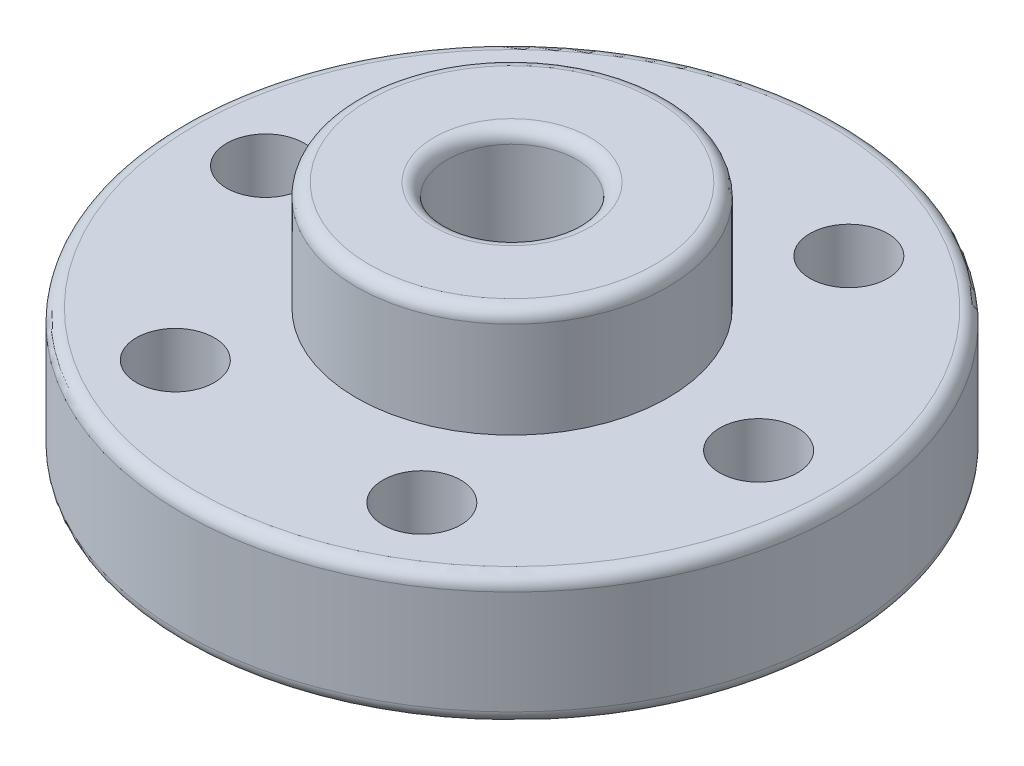
ISO-10303-21;
HEADER;
FILE_DESCRIPTION(('STEP AP214'),'2;1');
FILE_NAME('part.step','',(''),(''),'','','');
FILE_SCHEMA(('AUTOMOTIVE_DESIGN { 1 0 10303 214 1 1 1 1 }'));
ENDSEC;
DATA;
#1=APPLICATION_CONTEXT('core data for automotive mechanical design processes');
#2=APPLICATION_PROTOCOL_DEFINITION('international standard','automotive_design',2000,#1);
#3=PRODUCT_CONTEXT('',#1,'mechanical');
#4=PRODUCT('Part','Part','',(#3));
#5=PRODUCT_RELATED_PRODUCT_CATEGORY('part','',(#4));
#6=PRODUCT_DEFINITION_FORMATION('','',#4);
#7=PRODUCT_DEFINITION_CONTEXT('part definition',#1,'design');
#8=PRODUCT_DEFINITION('design','',#6,#7);
#9=PRODUCT_DEFINITION_SHAPE('','',#8);
#10=(LENGTH_UNIT() NAMED_UNIT(*) SI_UNIT(.MILLI.,.METRE.));
#11=(NAMED_UNIT(*) PLANE_ANGLE_UNIT() SI_UNIT($,.RADIAN.));
#12=(NAMED_UNIT(*) SI_UNIT($,.STERADIAN.) SOLID_ANGLE_UNIT());
#13=UNCERTAINTY_MEASURE_WITH_UNIT(LENGTH_MEASURE(1.E-05),#10,'distance_accuracy_value','');
#14=(GEOMETRIC_REPRESENTATION_CONTEXT(3) GLOBAL_UNCERTAINTY_ASSIGNED_CONTEXT((#13)) GLOBAL_UNIT_ASSIGNED_CONTEXT((#10,
#11,#12)) REPRESENTATION_CONTEXT('',''));
#15=CARTESIAN_POINT('',(0.,0.,0.));
#16=DIRECTION('',(0.,0.,1.));
#17=DIRECTION('',(1.,0.,0.));
#18=AXIS2_PLACEMENT_3D('',#15,#16,#17);
#19=CARTESIAN_POINT('',(-4.74999999999999,5.,-8.22724133595217));
#20=DIRECTION('',(0.,-1.,0.));
#21=DIRECTION('',(0.,0.,-1.));
#22=AXIS2_PLACEMENT_3D('',#19,#20,#21);
#23=CYLINDRICAL_SURFACE('',#22,1.5);
#24=CARTESIAN_POINT('',(-4.74999999999999,5.,-8.22724133595217));
#25=DIRECTION('',(0.,1.,0.));
#26=DIRECTION('',(0.,0.,1.));
#27=AXIS2_PLACEMENT_3D('',#24,#25,#26);
#28=CIRCLE('',#27,1.5);
#29=CARTESIAN_POINT('',(-4.74999999999999,5.,-6.72724133595217));
#30=VERTEX_POINT('',#29);
#31=EDGE_CURVE('E70',#30,#30,#28,.T.);
#32=ORIENTED_EDGE('',*,*,#31,.T.);
#33=EDGE_LOOP('',(#32));
#34=FACE_BOUND('',#33,.T.);
#35=CARTESIAN_POINT('',(-4.74999999999999,0.,-8.22724133595217));
#36=DIRECTION('',(0.,1.,0.));
#37=DIRECTION('',(0.,0.,1.));
#38=AXIS2_PLACEMENT_3D('',#35,#36,#37);
#39=CIRCLE('',#38,1.5);
#40=CARTESIAN_POINT('',(-4.74999999999999,0.,-6.72724133595217));
#41=VERTEX_POINT('',#40);
#42=EDGE_CURVE('E71',#41,#41,#39,.T.);
#43=ORIENTED_EDGE('',*,*,#42,.F.);
#44=EDGE_LOOP('',(#43));
#45=FACE_BOUND('',#44,.T.);
#46=ADVANCED_FACE('F32',(#34,#45),#23,.F.);
#47=CARTESIAN_POINT('',(-9.5,5.,0.));
#48=DIRECTION('',(0.,-1.,0.));
#49=DIRECTION('',(0.,0.,-1.));
#50=AXIS2_PLACEMENT_3D('',#47,#48,#49);
#51=CYLINDRICAL_SURFACE('',#50,1.5);
#52=CARTESIAN_POINT('',(-9.5,5.,0.));
#53=DIRECTION('',(0.,1.,0.));
#54=DIRECTION('',(0.,0.,1.));
#55=AXIS2_PLACEMENT_3D('',#52,#53,#54);
#56=CIRCLE('',#55,1.5);
#57=CARTESIAN_POINT('',(-9.5,5.,1.5));
#58=VERTEX_POINT('',#57);
#59=EDGE_CURVE('E93',#58,#58,#56,.T.);
#60=ORIENTED_EDGE('',*,*,#59,.T.);
#61=EDGE_LOOP('',(#60));
#62=FACE_BOUND('',#61,.T.);
#63=CARTESIAN_POINT('',(-9.5,0.,0.));
#64=DIRECTION('',(0.,1.,0.));
#65=DIRECTION('',(0.,0.,1.));
#66=AXIS2_PLACEMENT_3D('',#63,#64,#65);
#67=CIRCLE('',#66,1.5);
#68=CARTESIAN_POINT('',(-9.5,0.,1.5));
#69=VERTEX_POINT('',#68);
#70=EDGE_CURVE('E75',#69,#69,#67,.T.);
#71=ORIENTED_EDGE('',*,*,#70,.F.);
#72=EDGE_LOOP('',(#71));
#73=FACE_BOUND('',#72,.T.);
#74=ADVANCED_FACE('F132',(#62,#73),#51,.F.);
#75=CARTESIAN_POINT('',(-4.75,5.,8.22724133595217));
#76=DIRECTION('',(0.,-1.,0.));
#77=DIRECTION('',(0.,0.,-1.));
#78=AXIS2_PLACEMENT_3D('',#75,#76,#77);
#79=CYLINDRICAL_SURFACE('',#78,1.5);
#80=CARTESIAN_POINT('',(-4.75,5.,8.22724133595217));
#81=DIRECTION('',(0.,1.,0.));
#82=DIRECTION('',(0.,0.,1.));
#83=AXIS2_PLACEMENT_3D('',#80,#81,#82);
#84=CIRCLE('',#83,1.5);
#85=CARTESIAN_POINT('',(-4.75,5.,9.72724133595217));
#86=VERTEX_POINT('',#85);
#87=EDGE_CURVE('E96',#86,#86,#84,.T.);
#88=ORIENTED_EDGE('',*,*,#87,.T.);
#89=EDGE_LOOP('',(#88));
#90=FACE_BOUND('',#89,.T.);
#91=CARTESIAN_POINT('',(-4.75,0.,8.22724133595217));
#92=DIRECTION('',(0.,1.,0.));
#93=DIRECTION('',(0.,0.,1.));
#94=AXIS2_PLACEMENT_3D('',#91,#92,#93);
#95=CIRCLE('',#94,1.5);
#96=CARTESIAN_POINT('',(-4.75,0.,9.72724133595217));
#97=VERTEX_POINT('',#96);
#98=EDGE_CURVE('E78',#97,#97,#95,.T.);
#99=ORIENTED_EDGE('',*,*,#98,.F.);
#100=EDGE_LOOP('',(#99));
#101=FACE_BOUND('',#100,.T.);
#102=ADVANCED_FACE('F152',(#90,#101),#79,.F.);
#103=CARTESIAN_POINT('',(4.75,5.,8.22724133595217));
#104=DIRECTION('',(0.,-1.,0.));
#105=DIRECTION('',(0.,0.,-1.));
#106=AXIS2_PLACEMENT_3D('',#103,#104,#105);
#107=CYLINDRICAL_SURFACE('',#106,1.5);
#108=CARTESIAN_POINT('',(4.75,5.,8.22724133595217));
#109=DIRECTION('',(0.,1.,0.));
#110=DIRECTION('',(0.,0.,1.));
#111=AXIS2_PLACEMENT_3D('',#108,#109,#110);
#112=CIRCLE('',#111,1.5);
#113=CARTESIAN_POINT('',(4.75,5.,9.72724133595217));
#114=VERTEX_POINT('',#113);
#115=EDGE_CURVE('E99',#114,#114,#112,.T.);
#116=ORIENTED_EDGE('',*,*,#115,.T.);
#117=EDGE_LOOP('',(#116));
#118=FACE_BOUND('',#117,.T.);
#119=CARTESIAN_POINT('',(4.75,0.,8.22724133595217));
#120=DIRECTION('',(0.,1.,0.));
#121=DIRECTION('',(0.,0.,1.));
#122=AXIS2_PLACEMENT_3D('',#119,#120,#121);
#123=CIRCLE('',#122,1.5);
#124=CARTESIAN_POINT('',(4.75,0.,9.72724133595217));
#125=VERTEX_POINT('',#124);
#126=EDGE_CURVE('E81',#125,#125,#123,.T.);
#127=ORIENTED_EDGE('',*,*,#126,.F.);
#128=EDGE_LOOP('',(#127));
#129=FACE_BOUND('',#128,.T.);
#130=ADVANCED_FACE('F156',(#118,#129),#107,.F.);
#131=CARTESIAN_POINT('',(9.5,5.,0.));
#132=DIRECTION('',(0.,-1.,0.));
#133=DIRECTION('',(0.,0.,-1.));
#134=AXIS2_PLACEMENT_3D('',#131,#132,#133);
#135=CYLINDRICAL_SURFACE('',#134,1.5);
#136=CARTESIAN_POINT('',(9.5,5.,0.));
#137=DIRECTION('',(0.,1.,0.));
#138=DIRECTION('',(0.,0.,1.));
#139=AXIS2_PLACEMENT_3D('',#136,#137,#138);
#140=CIRCLE('',#139,1.5);
#141=CARTESIAN_POINT('',(9.5,5.,1.5));
#142=VERTEX_POINT('',#141);
#143=EDGE_CURVE('E102',#142,#142,#140,.T.);
#144=ORIENTED_EDGE('',*,*,#143,.T.);
#145=EDGE_LOOP('',(#144));
#146=FACE_BOUND('',#145,.T.);
#147=CARTESIAN_POINT('',(9.5,0.,0.));
#148=DIRECTION('',(0.,1.,0.));
#149=DIRECTION('',(0.,0.,1.));
#150=AXIS2_PLACEMENT_3D('',#147,#148,#149);
#151=CIRCLE('',#150,1.5);
#152=CARTESIAN_POINT('',(9.5,0.,1.5));
#153=VERTEX_POINT('',#152);
#154=EDGE_CURVE('E84',#153,#153,#151,.T.);
#155=ORIENTED_EDGE('',*,*,#154,.F.);
#156=EDGE_LOOP('',(#155));
#157=FACE_BOUND('',#156,.T.);
#158=ADVANCED_FACE('F160',(#146,#157),#135,.F.);
#159=CARTESIAN_POINT('',(0.,5.,0.));
#160=DIRECTION('',(0.,-1.,0.));
#161=DIRECTION('',(0.,0.,-1.));
#162=AXIS2_PLACEMENT_3D('',#159,#160,#161);
#163=CYLINDRICAL_SURFACE('',#162,2.5);
#164=CARTESIAN_POINT('',(0.,0.5,0.));
#165=DIRECTION('',(0.,1.,0.));
#166=DIRECTION('',(0.,0.,1.));
#167=AXIS2_PLACEMENT_3D('',#164,#165,#166);
#168=CIRCLE('',#167,2.5);
#169=CARTESIAN_POINT('',(0.,0.5,2.5));
#170=VERTEX_POINT('',#169);
#171=EDGE_CURVE('E58',#170,#170,#168,.F.);
#172=ORIENTED_EDGE('',*,*,#171,.T.);
#173=EDGE_LOOP('',(#172));
#174=FACE_BOUND('',#173,.T.);
#175=CARTESIAN_POINT('',(0.,8.7,0.));
#176=DIRECTION('',(0.,1.,0.));
#177=DIRECTION('',(0.,0.,1.));
#178=AXIS2_PLACEMENT_3D('',#175,#176,#177);
#179=CIRCLE('',#178,2.5);
#180=CARTESIAN_POINT('',(0.,8.7,2.5));
#181=VERTEX_POINT('',#180);
#182=EDGE_CURVE('E61',#181,#181,#179,.T.);
#183=ORIENTED_EDGE('',*,*,#182,.T.);
#184=EDGE_LOOP('',(#183));
#185=FACE_BOUND('',#184,.T.);
#186=ADVANCED_FACE('F164',(#174,#185),#163,.F.);
#187=CARTESIAN_POINT('',(4.75000000000001,5.,-8.22724133595217));
#188=DIRECTION('',(0.,-1.,0.));
#189=DIRECTION('',(0.,0.,-1.));
#190=AXIS2_PLACEMENT_3D('',#187,#188,#189);
#191=CYLINDRICAL_SURFACE('',#190,1.5);
#192=CARTESIAN_POINT('',(4.75000000000001,5.,-8.22724133595217));
#193=DIRECTION('',(0.,1.,0.));
#194=DIRECTION('',(0.,0.,1.));
#195=AXIS2_PLACEMENT_3D('',#192,#193,#194);
#196=CIRCLE('',#195,1.5);
#197=CARTESIAN_POINT('',(4.75000000000001,5.,-6.72724133595217));
#198=VERTEX_POINT('',#197);
#199=EDGE_CURVE('E74',#198,#198,#196,.T.);
#200=ORIENTED_EDGE('',*,*,#199,.T.);
#201=EDGE_LOOP('',(#200));
#202=FACE_BOUND('',#201,.T.);
#203=CARTESIAN_POINT('',(4.75000000000001,0.,-8.22724133595217));
#204=DIRECTION('',(0.,1.,0.));
#205=DIRECTION('',(0.,0.,1.));
#206=AXIS2_PLACEMENT_3D('',#203,#204,#205);
#207=CIRCLE('',#206,1.5);
#208=CARTESIAN_POINT('',(4.75000000000001,0.,-6.72724133595217));
#209=VERTEX_POINT('',#208);
#210=EDGE_CURVE('E87',#209,#209,#207,.T.);
#211=ORIENTED_EDGE('',*,*,#210,.F.);
#212=EDGE_LOOP('',(#211));
#213=FACE_BOUND('',#212,.T.);
#214=ADVANCED_FACE('F147',(#202,#213),#191,.F.);
#215=CARTESIAN_POINT('',(0.,5.,0.));
#216=DIRECTION('',(0.,-1.,0.));
#217=DIRECTION('',(0.,0.,-1.));
#218=AXIS2_PLACEMENT_3D('',#215,#216,#217);
#219=CYLINDRICAL_SURFACE('',#218,12.7);
#220=CARTESIAN_POINT('',(0.,0.5,0.));
#221=DIRECTION('',(0.,1.,0.));
#222=DIRECTION('',(0.,0.,1.));
#223=AXIS2_PLACEMENT_3D('',#220,#221,#222);
#224=CIRCLE('',#223,12.7);
#225=CARTESIAN_POINT('',(0.,0.5,12.7));
#226=VERTEX_POINT('',#225);
#227=EDGE_CURVE('E52',#226,#226,#224,.T.);
#228=ORIENTED_EDGE('',*,*,#227,.T.);
#229=EDGE_LOOP('',(#228));
#230=FACE_BOUND('',#229,.T.);
#231=CARTESIAN_POINT('',(0.,4.5,0.));
#232=DIRECTION('',(0.,1.,0.));
#233=DIRECTION('',(0.,0.,1.));
#234=AXIS2_PLACEMENT_3D('',#231,#232,#233);
#235=CIRCLE('',#234,12.7);
#236=CARTESIAN_POINT('',(0.,4.5,12.7));
#237=VERTEX_POINT('',#236);
#238=EDGE_CURVE('E55',#237,#237,#235,.F.);
#239=ORIENTED_EDGE('',*,*,#238,.T.);
#240=EDGE_LOOP('',(#239));
#241=FACE_BOUND('',#240,.T.);
#242=ADVANCED_FACE('F116',(#230,#241),#219,.T.);
#243=CARTESIAN_POINT('',(0.,5.,0.));
#244=DIRECTION('',(0.,1.,0.));
#245=DIRECTION('',(0.,0.,1.));
#246=AXIS2_PLACEMENT_3D('',#243,#244,#245);
#247=PLANE('',#246);
#248=CARTESIAN_POINT('',(0.,5.,0.));
#249=DIRECTION('',(0.,1.,0.));
#250=DIRECTION('',(0.,0.,1.));
#251=AXIS2_PLACEMENT_3D('',#248,#249,#250);
#252=CIRCLE('',#251,12.2);
#253=CARTESIAN_POINT('',(0.,5.,12.2));
#254=VERTEX_POINT('',#253);
#255=EDGE_CURVE('E39',#254,#254,#252,.T.);
#256=ORIENTED_EDGE('',*,*,#255,.T.);
#257=EDGE_LOOP('',(#256));
#258=FACE_BOUND('',#257,.T.);
#259=CARTESIAN_POINT('',(0.,5.,0.));
#260=DIRECTION('',(0.,1.,0.));
#261=DIRECTION('',(0.,0.,1.));
#262=AXIS2_PLACEMENT_3D('',#259,#260,#261);
#263=CIRCLE('',#262,6.);
#264=CARTESIAN_POINT('',(0.,5.,6.));
#265=VERTEX_POINT('',#264);
#266=EDGE_CURVE('E90',#265,#265,#263,.T.);
#267=ORIENTED_EDGE('',*,*,#266,.F.);
#268=EDGE_LOOP('',(#267));
#269=FACE_BOUND('',#268,.T.);
#270=ORIENTED_EDGE('',*,*,#199,.F.);
#271=EDGE_LOOP('',(#270));
#272=FACE_BOUND('',#271,.T.);
#273=ORIENTED_EDGE('',*,*,#143,.F.);
#274=EDGE_LOOP('',(#273));
#275=FACE_BOUND('',#274,.T.);
#276=ORIENTED_EDGE('',*,*,#115,.F.);
#277=EDGE_LOOP('',(#276));
#278=FACE_BOUND('',#277,.T.);
#279=ORIENTED_EDGE('',*,*,#87,.F.);
#280=EDGE_LOOP('',(#279));
#281=FACE_BOUND('',#280,.T.);
#282=ORIENTED_EDGE('',*,*,#59,.F.);
#283=EDGE_LOOP('',(#282));
#284=FACE_BOUND('',#283,.T.);
#285=ORIENTED_EDGE('',*,*,#31,.F.);
#286=EDGE_LOOP('',(#285));
#287=FACE_BOUND('',#286,.T.);
#288=ADVANCED_FACE('F112',(#258,#269,#272,#275,#278,#281,#284,#287),#247,.T.);
#289=CARTESIAN_POINT('',(0.,0.,0.));
#290=DIRECTION('',(0.,1.,0.));
#291=DIRECTION('',(0.,0.,1.));
#292=AXIS2_PLACEMENT_3D('',#289,#290,#291);
#293=PLANE('',#292);
#294=CARTESIAN_POINT('',(0.,0.,0.));
#295=DIRECTION('',(0.,1.,0.));
#296=DIRECTION('',(0.,0.,1.));
#297=AXIS2_PLACEMENT_3D('',#294,#295,#296);
#298=CIRCLE('',#297,3.);
#299=CARTESIAN_POINT('',(0.,0.,3.));
#300=VERTEX_POINT('',#299);
#301=EDGE_CURVE('E64',#300,#300,#298,.T.);
#302=ORIENTED_EDGE('',*,*,#301,.T.);
#303=EDGE_LOOP('',(#302));
#304=FACE_BOUND('',#303,.T.);
#305=CARTESIAN_POINT('',(0.,0.,0.));
#306=DIRECTION('',(0.,1.,0.));
#307=DIRECTION('',(0.,0.,1.));
#308=AXIS2_PLACEMENT_3D('',#305,#306,#307);
#309=CIRCLE('',#308,12.2);
#310=CARTESIAN_POINT('',(0.,0.,12.2));
#311=VERTEX_POINT('',#310);
#312=EDGE_CURVE('E67',#311,#311,#309,.F.);
#313=ORIENTED_EDGE('',*,*,#312,.T.);
#314=EDGE_LOOP('',(#313));
#315=FACE_BOUND('',#314,.T.);
#316=ORIENTED_EDGE('',*,*,#210,.T.);
#317=EDGE_LOOP('',(#316));
#318=FACE_BOUND('',#317,.T.);
#319=ORIENTED_EDGE('',*,*,#154,.T.);
#320=EDGE_LOOP('',(#319));
#321=FACE_BOUND('',#320,.T.);
#322=ORIENTED_EDGE('',*,*,#126,.T.);
#323=EDGE_LOOP('',(#322));
#324=FACE_BOUND('',#323,.T.);
#325=ORIENTED_EDGE('',*,*,#98,.T.);
#326=EDGE_LOOP('',(#325));
#327=FACE_BOUND('',#326,.T.);
#328=ORIENTED_EDGE('',*,*,#70,.T.);
#329=EDGE_LOOP('',(#328));
#330=FACE_BOUND('',#329,.T.);
#331=ORIENTED_EDGE('',*,*,#42,.T.);
#332=EDGE_LOOP('',(#331));
#333=FACE_BOUND('',#332,.T.);
#334=ADVANCED_FACE('F115',(#304,#315,#318,#321,#324,#327,#330,#333),#293,.F.);
#335=CARTESIAN_POINT('',(0.,9.2,0.));
#336=DIRECTION('',(0.,-1.,0.));
#337=DIRECTION('',(0.,0.,-1.));
#338=AXIS2_PLACEMENT_3D('',#335,#336,#337);
#339=CYLINDRICAL_SURFACE('',#338,6.);
#340=CARTESIAN_POINT('',(0.,8.7,0.));
#341=DIRECTION('',(0.,1.,0.));
#342=DIRECTION('',(0.,0.,1.));
#343=AXIS2_PLACEMENT_3D('',#340,#341,#342);
#344=CIRCLE('',#343,6.);
#345=CARTESIAN_POINT('',(0.,8.7,6.));
#346=VERTEX_POINT('',#345);
#347=EDGE_CURVE('E10',#346,#346,#344,.F.);
#348=ORIENTED_EDGE('',*,*,#347,.T.);
#349=EDGE_LOOP('',(#348));
#350=FACE_BOUND('',#349,.T.);
#351=ORIENTED_EDGE('',*,*,#266,.T.);
#352=EDGE_LOOP('',(#351));
#353=FACE_BOUND('',#352,.T.);
#354=ADVANCED_FACE('F110',(#350,#353),#339,.T.);
#355=CARTESIAN_POINT('',(0.,9.2,0.));
#356=DIRECTION('',(0.,1.,0.));
#357=DIRECTION('',(0.,0.,1.));
#358=AXIS2_PLACEMENT_3D('',#355,#356,#357);
#359=PLANE('',#358);
#360=CARTESIAN_POINT('',(0.,9.2,0.));
#361=DIRECTION('',(0.,1.,0.));
#362=DIRECTION('',(0.,0.,1.));
#363=AXIS2_PLACEMENT_3D('',#360,#361,#362);
#364=CIRCLE('',#363,3.);
#365=CARTESIAN_POINT('',(0.,9.2,3.));
#366=VERTEX_POINT('',#365);
#367=EDGE_CURVE('E43',#366,#366,#364,.F.);
#368=ORIENTED_EDGE('',*,*,#367,.T.);
#369=EDGE_LOOP('',(#368));
#370=FACE_BOUND('',#369,.T.);
#371=CARTESIAN_POINT('',(0.,9.2,0.));
#372=DIRECTION('',(0.,1.,0.));
#373=DIRECTION('',(0.,0.,1.));
#374=AXIS2_PLACEMENT_3D('',#371,#372,#373);
#375=CIRCLE('',#374,5.5);
#376=CARTESIAN_POINT('',(0.,9.2,5.5));
#377=VERTEX_POINT('',#376);
#378=EDGE_CURVE('E47',#377,#377,#375,.T.);
#379=ORIENTED_EDGE('',*,*,#378,.T.);
#380=EDGE_LOOP('',(#379));
#381=FACE_BOUND('',#380,.T.);
#382=ADVANCED_FACE('F142',(#370,#381),#359,.T.);
#383=CARTESIAN_POINT('',(0.,0.5,0.));
#384=DIRECTION('',(0.,1.,0.));
#385=DIRECTION('',(0.,0.,1.));
#386=AXIS2_PLACEMENT_3D('',#383,#384,#385);
#387=TOROIDAL_SURFACE('',#386,3.,0.5);
#388=ORIENTED_EDGE('',*,*,#171,.F.);
#389=EDGE_LOOP('',(#388));
#390=FACE_BOUND('',#389,.T.);
#391=ORIENTED_EDGE('',*,*,#301,.F.);
#392=EDGE_LOOP('',(#391));
#393=FACE_BOUND('',#392,.T.);
#394=ADVANCED_FACE('F172',(#390,#393),#387,.T.);
#395=CARTESIAN_POINT('',(0.,0.5,0.));
#396=DIRECTION('',(0.,1.,0.));
#397=DIRECTION('',(0.,0.,1.));
#398=AXIS2_PLACEMENT_3D('',#395,#396,#397);
#399=TOROIDAL_SURFACE('',#398,12.2,0.5);
#400=ORIENTED_EDGE('',*,*,#312,.F.);
#401=EDGE_LOOP('',(#400));
#402=FACE_BOUND('',#401,.T.);
#403=ORIENTED_EDGE('',*,*,#227,.F.);
#404=EDGE_LOOP('',(#403));
#405=FACE_BOUND('',#404,.T.);
#406=ADVANCED_FACE('F175',(#402,#405),#399,.T.);
#407=CARTESIAN_POINT('',(0.,8.7,0.));
#408=DIRECTION('',(0.,1.,0.));
#409=DIRECTION('',(0.,0.,1.));
#410=AXIS2_PLACEMENT_3D('',#407,#408,#409);
#411=TOROIDAL_SURFACE('',#410,3.,0.5);
#412=ORIENTED_EDGE('',*,*,#367,.F.);
#413=EDGE_LOOP('',(#412));
#414=FACE_BOUND('',#413,.T.);
#415=ORIENTED_EDGE('',*,*,#182,.F.);
#416=EDGE_LOOP('',(#415));
#417=FACE_BOUND('',#416,.T.);
#418=ADVANCED_FACE('F179',(#414,#417),#411,.T.);
#419=CARTESIAN_POINT('',(0.,4.5,0.));
#420=DIRECTION('',(0.,1.,0.));
#421=DIRECTION('',(0.,0.,1.));
#422=AXIS2_PLACEMENT_3D('',#419,#420,#421);
#423=TOROIDAL_SURFACE('',#422,12.2,0.5);
#424=ORIENTED_EDGE('',*,*,#238,.F.);
#425=EDGE_LOOP('',(#424));
#426=FACE_BOUND('',#425,.T.);
#427=ORIENTED_EDGE('',*,*,#255,.F.);
#428=EDGE_LOOP('',(#427));
#429=FACE_BOUND('',#428,.T.);
#430=ADVANCED_FACE('F182',(#426,#429),#423,.T.);
#431=CARTESIAN_POINT('',(0.,8.7,0.));
#432=DIRECTION('',(0.,1.,0.));
#433=DIRECTION('',(0.,0.,1.));
#434=AXIS2_PLACEMENT_3D('',#431,#432,#433);
#435=TOROIDAL_SURFACE('',#434,5.5,0.5);
#436=ORIENTED_EDGE('',*,*,#347,.F.);
#437=EDGE_LOOP('',(#436));
#438=FACE_BOUND('',#437,.T.);
#439=ORIENTED_EDGE('',*,*,#378,.F.);
#440=EDGE_LOOP('',(#439));
#441=FACE_BOUND('',#440,.T.);
#442=ADVANCED_FACE('F34',(#438,#441),#435,.T.);
#443=CLOSED_SHELL('',(#46,#74,#102,#130,#158,#186,#214,#242,#288,#334,#354,#382,#394,#406,#418,
#430,#442));
#444=MANIFOLD_SOLID_BREP('B2',#443);
#445=ADVANCED_BREP_SHAPE_REPRESENTATION('',(#18,#444),#14);
#446=SHAPE_DEFINITION_REPRESENTATION(#9,#445);
ENDSEC;
END-ISO-10303-21;
